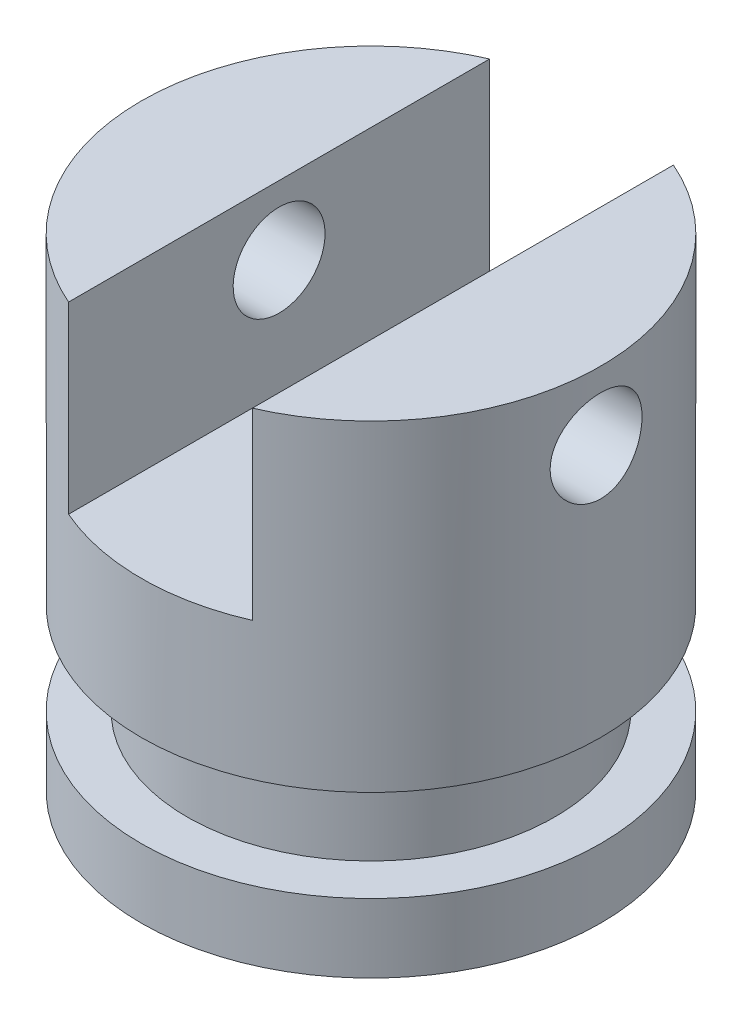
ISO-10303-21;
HEADER;
FILE_DESCRIPTION(('STEP AP214'),'2;1');
FILE_NAME('part.step','',(''),(''),'','','');
FILE_SCHEMA(('AUTOMOTIVE_DESIGN { 1 0 10303 214 1 1 1 1 }'));
ENDSEC;
DATA;
#1=APPLICATION_CONTEXT('core data for automotive mechanical design processes');
#2=APPLICATION_PROTOCOL_DEFINITION('international standard','automotive_design',2000,#1);
#3=PRODUCT_CONTEXT('',#1,'mechanical');
#4=PRODUCT('Part','Part','',(#3));
#5=PRODUCT_RELATED_PRODUCT_CATEGORY('part','',(#4));
#6=PRODUCT_DEFINITION_FORMATION('','',#4);
#7=PRODUCT_DEFINITION_CONTEXT('part definition',#1,'design');
#8=PRODUCT_DEFINITION('design','',#6,#7);
#9=PRODUCT_DEFINITION_SHAPE('','',#8);
#10=(LENGTH_UNIT() NAMED_UNIT(*) SI_UNIT(.MILLI.,.METRE.));
#11=(NAMED_UNIT(*) PLANE_ANGLE_UNIT() SI_UNIT($,.RADIAN.));
#12=(NAMED_UNIT(*) SI_UNIT($,.STERADIAN.) SOLID_ANGLE_UNIT());
#13=UNCERTAINTY_MEASURE_WITH_UNIT(LENGTH_MEASURE(1.E-05),#10,'distance_accuracy_value','');
#14=(GEOMETRIC_REPRESENTATION_CONTEXT(3) GLOBAL_UNCERTAINTY_ASSIGNED_CONTEXT((#13)) GLOBAL_UNIT_ASSIGNED_CONTEXT((#10,
#11,#12)) REPRESENTATION_CONTEXT('',''));
#15=CARTESIAN_POINT('',(0.,0.,0.));
#16=DIRECTION('',(0.,0.,1.));
#17=DIRECTION('',(1.,0.,0.));
#18=AXIS2_PLACEMENT_3D('',#15,#16,#17);
#19=CARTESIAN_POINT('',(5.,10.5,0.));
#20=DIRECTION('',(0.,-1.,0.));
#21=DIRECTION('',(1.,0.,0.));
#22=AXIS2_PLACEMENT_3D('',#19,#20,#21);
#23=PLANE('',#22);
#24=CARTESIAN_POINT('',(0.,10.5,0.));
#25=DIRECTION('',(0.,1.,0.));
#26=DIRECTION('',(-1.,0.,0.));
#27=AXIS2_PLACEMENT_3D('',#24,#25,#26);
#28=CIRCLE('',#27,5.);
#29=CARTESIAN_POINT('',(2.,10.5,4.58257569495584));
#30=VERTEX_POINT('',#29);
#31=CARTESIAN_POINT('',(2.,10.5,-4.58257569495584));
#32=VERTEX_POINT('',#31);
#33=EDGE_CURVE('E121',#30,#32,#28,.T.);
#34=ORIENTED_EDGE('',*,*,#33,.T.);
#35=DIRECTION('',(0.,0.,-1.));
#36=VECTOR('',#35,1.);
#37=CARTESIAN_POINT('',(2.,10.5,4.58257569495584));
#38=LINE('',#37,#36);
#39=EDGE_CURVE('E82',#30,#32,#38,.T.);
#40=ORIENTED_EDGE('',*,*,#39,.F.);
#41=EDGE_LOOP('',(#34,#40));
#42=FACE_BOUND('',#41,.T.);
#43=ADVANCED_FACE('F39',(#42),#23,.F.);
#44=CARTESIAN_POINT('',(0.,0.,0.));
#45=DIRECTION('',(0.,1.,0.));
#46=DIRECTION('',(-1.,0.,0.));
#47=AXIS2_PLACEMENT_3D('',#44,#45,#46);
#48=PLANE('',#47);
#49=CARTESIAN_POINT('',(0.,0.,0.));
#50=DIRECTION('',(0.,1.,0.));
#51=DIRECTION('',(-1.,0.,0.));
#52=AXIS2_PLACEMENT_3D('',#49,#50,#51);
#53=CIRCLE('',#52,5.);
#54=CARTESIAN_POINT('',(-5.,0.,0.));
#55=VERTEX_POINT('',#54);
#56=EDGE_CURVE('E134',#55,#55,#53,.T.);
#57=ORIENTED_EDGE('',*,*,#56,.F.);
#58=EDGE_LOOP('',(#57));
#59=FACE_BOUND('',#58,.T.);
#60=ADVANCED_FACE('F41',(#59),#48,.F.);
#61=CARTESIAN_POINT('',(0.,10.5,0.));
#62=DIRECTION('',(0.,1.,0.));
#63=DIRECTION('',(-1.,0.,0.));
#64=AXIS2_PLACEMENT_3D('',#61,#62,#63);
#65=CYLINDRICAL_SURFACE('',#64,5.);
#66=CARTESIAN_POINT('',(0.,1.5,0.));
#67=DIRECTION('',(0.,1.,0.));
#68=DIRECTION('',(-1.,0.,0.));
#69=AXIS2_PLACEMENT_3D('',#66,#67,#68);
#70=CIRCLE('',#69,5.);
#71=CARTESIAN_POINT('',(-5.,1.5,0.));
#72=VERTEX_POINT('',#71);
#73=EDGE_CURVE('E131',#72,#72,#70,.T.);
#74=ORIENTED_EDGE('',*,*,#73,.F.);
#75=EDGE_LOOP('',(#74));
#76=FACE_BOUND('',#75,.T.);
#77=ORIENTED_EDGE('',*,*,#56,.T.);
#78=EDGE_LOOP('',(#77));
#79=FACE_BOUND('',#78,.T.);
#80=ADVANCED_FACE('F172',(#76,#79),#65,.T.);
#81=CARTESIAN_POINT('',(5.,1.5,0.));
#82=DIRECTION('',(0.,-1.,0.));
#83=DIRECTION('',(1.,0.,0.));
#84=AXIS2_PLACEMENT_3D('',#81,#82,#83);
#85=PLANE('',#84);
#86=CARTESIAN_POINT('',(0.,1.5,0.));
#87=DIRECTION('',(0.,1.,0.));
#88=DIRECTION('',(-1.,0.,0.));
#89=AXIS2_PLACEMENT_3D('',#86,#87,#88);
#90=CIRCLE('',#89,4.);
#91=CARTESIAN_POINT('',(-4.,1.5,0.));
#92=VERTEX_POINT('',#91);
#93=EDGE_CURVE('E128',#92,#92,#90,.T.);
#94=ORIENTED_EDGE('',*,*,#93,.F.);
#95=EDGE_LOOP('',(#94));
#96=FACE_BOUND('',#95,.T.);
#97=ORIENTED_EDGE('',*,*,#73,.T.);
#98=EDGE_LOOP('',(#97));
#99=FACE_BOUND('',#98,.T.);
#100=ADVANCED_FACE('F239',(#96,#99),#85,.F.);
#101=CARTESIAN_POINT('',(0.,10.5,0.));
#102=DIRECTION('',(0.,1.,0.));
#103=DIRECTION('',(-1.,0.,0.));
#104=AXIS2_PLACEMENT_3D('',#101,#102,#103);
#105=CYLINDRICAL_SURFACE('',#104,4.);
#106=CARTESIAN_POINT('',(0.,3.5,0.));
#107=DIRECTION('',(0.,1.,0.));
#108=DIRECTION('',(-1.,0.,0.));
#109=AXIS2_PLACEMENT_3D('',#106,#107,#108);
#110=CIRCLE('',#109,4.);
#111=CARTESIAN_POINT('',(-4.,3.5,0.));
#112=VERTEX_POINT('',#111);
#113=EDGE_CURVE('E125',#112,#112,#110,.T.);
#114=ORIENTED_EDGE('',*,*,#113,.F.);
#115=EDGE_LOOP('',(#114));
#116=FACE_BOUND('',#115,.T.);
#117=ORIENTED_EDGE('',*,*,#93,.T.);
#118=EDGE_LOOP('',(#117));
#119=FACE_BOUND('',#118,.T.);
#120=ADVANCED_FACE('F231',(#116,#119),#105,.T.);
#121=CARTESIAN_POINT('',(4.,3.5,0.));
#122=DIRECTION('',(0.,1.,0.));
#123=DIRECTION('',(-1.,0.,0.));
#124=AXIS2_PLACEMENT_3D('',#121,#122,#123);
#125=PLANE('',#124);
#126=CARTESIAN_POINT('',(0.,3.5,0.));
#127=DIRECTION('',(0.,1.,0.));
#128=DIRECTION('',(-1.,0.,0.));
#129=AXIS2_PLACEMENT_3D('',#126,#127,#128);
#130=CIRCLE('',#129,5.);
#131=CARTESIAN_POINT('',(-5.,3.5,0.));
#132=VERTEX_POINT('',#131);
#133=EDGE_CURVE('E122',#132,#132,#130,.T.);
#134=ORIENTED_EDGE('',*,*,#133,.F.);
#135=EDGE_LOOP('',(#134));
#136=FACE_BOUND('',#135,.T.);
#137=ORIENTED_EDGE('',*,*,#113,.T.);
#138=EDGE_LOOP('',(#137));
#139=FACE_BOUND('',#138,.T.);
#140=ADVANCED_FACE('F165',(#136,#139),#125,.F.);
#141=CARTESIAN_POINT('',(0.,10.5,0.));
#142=DIRECTION('',(0.,1.,0.));
#143=DIRECTION('',(-1.,0.,0.));
#144=AXIS2_PLACEMENT_3D('',#141,#142,#143);
#145=CYLINDRICAL_SURFACE('',#144,5.);
#146=CARTESIAN_POINT('',(-5.,8.,0.));
#147=CARTESIAN_POINT('',(-4.99999897580871,8.00000204449835,-0.0555769067926332));
#148=CARTESIAN_POINT('',(-4.99906385178231,8.00464884296765,-0.111179660201522));
#149=CARTESIAN_POINT('',(-4.99542365623231,8.02309850011525,-0.220813507689019));
#150=CARTESIAN_POINT('',(-4.99271717860186,8.03690863280151,-0.274843317541355));
#151=CARTESIAN_POINT('',(-4.98583649278287,8.07324127362079,-0.379730305263312));
#152=CARTESIAN_POINT('',(-4.98166369076718,8.09575543684469,-0.430590467933133));
#153=CARTESIAN_POINT('',(-4.97230398035314,8.1488322475113,-0.527807988864225));
#154=CARTESIAN_POINT('',(-4.96711713235707,8.17939441560721,-0.574165615075811));
#155=CARTESIAN_POINT('',(-4.9562216532997,8.24813849429144,-0.661693477314864));
#156=CARTESIAN_POINT('',(-4.95050745504347,8.2864083553912,-0.702793951158523));
#157=CARTESIAN_POINT('',(-4.93924180452588,8.3692924163917,-0.778036756608027));
#158=CARTESIAN_POINT('',(-4.93369036500424,8.41390711133512,-0.812178544770424));
#159=CARTESIAN_POINT('',(-4.92332441812615,8.50871619301188,-0.872831753347619));
#160=CARTESIAN_POINT('',(-4.91851707364946,8.55895764379636,-0.899270938865865));
#161=CARTESIAN_POINT('',(-4.91026268058418,8.66328181900408,-0.943305666580307));
#162=CARTESIAN_POINT('',(-4.90681549761962,8.71736416334635,-0.960902082437236));
#163=CARTESIAN_POINT('',(-4.90172805252205,8.82708436390792,-0.986525299884825));
#164=CARTESIAN_POINT('',(-4.90006470107188,8.88269254414223,-0.994674497958775));
#165=CARTESIAN_POINT('',(-4.89866375060627,8.99450982136434,-1.00155212772612));
#166=CARTESIAN_POINT('',(-4.89892595467841,9.05071885632015,-1.0002815227135));
#167=CARTESIAN_POINT('',(-4.90132551148185,9.16124678802101,-0.988454573101817));
#168=CARTESIAN_POINT('',(-4.90343452858764,9.21558140562732,-0.978038540243904));
#169=CARTESIAN_POINT('',(-4.90924546160001,9.321716076663,-0.948437884623049));
#170=CARTESIAN_POINT('',(-4.91294745357779,9.37351600891901,-0.929252843100679));
#171=CARTESIAN_POINT('',(-4.92155618500408,9.4735152617036,-0.882524783674718));
#172=CARTESIAN_POINT('',(-4.92647089813704,9.52168787956917,-0.854926151232113));
#173=CARTESIAN_POINT('',(-4.93694618773062,9.61277084997281,-0.792193574572677));
#174=CARTESIAN_POINT('',(-4.94250683838366,9.65568059685116,-0.757058764356827));
#175=CARTESIAN_POINT('',(-4.95377021241462,9.73582940245694,-0.679499934560582));
#176=CARTESIAN_POINT('',(-4.95947369210905,9.77295256785913,-0.636956161212443));
#177=CARTESIAN_POINT('',(-4.97028848714408,9.83955384630123,-0.546185024062009));
#178=CARTESIAN_POINT('',(-4.97539979488974,9.86903186129358,-0.497957587379388));
#179=CARTESIAN_POINT('',(-4.98446690160887,9.91952750922597,-0.39705938687892));
#180=CARTESIAN_POINT('',(-4.98842088848272,9.94053189364454,-0.3443818195853));
#181=CARTESIAN_POINT('',(-4.99471408987858,9.97336047403857,-0.236148976448665));
#182=CARTESIAN_POINT('',(-4.99705350000531,9.98518578207363,-0.180594050072449));
#183=CARTESIAN_POINT('',(-4.99982671866868,9.99915645379427,-0.0691794056271504));
#184=CARTESIAN_POINT('',(-5.0002917465247,10.0014604195403,-0.0133403283255763));
#185=CARTESIAN_POINT('',(-4.99935051930103,9.99675014105782,0.0979249341927138));
#186=CARTESIAN_POINT('',(-4.99794436941446,9.9897364206474,0.153351142443793));
#187=CARTESIAN_POINT('',(-4.99343832008018,9.96672162645604,0.261705659946541));
#188=CARTESIAN_POINT('',(-4.99035376404206,9.9508019315021,0.314651948339903));
#189=CARTESIAN_POINT('',(-4.98283552061033,9.91051601734419,0.417123627499667));
#190=CARTESIAN_POINT('',(-4.97840173214227,9.88614916532317,0.466648761637539));
#191=CARTESIAN_POINT('',(-4.96859911533294,9.82931750934869,0.561541173686216));
#192=CARTESIAN_POINT('',(-4.96321950437052,9.79675721896105,0.606850126752187));
#193=CARTESIAN_POINT('',(-4.95214734829882,9.72459080879272,0.691418019119206));
#194=CARTESIAN_POINT('',(-4.94645476968388,9.68498393360013,0.730676308930761));
#195=CARTESIAN_POINT('',(-4.93529303556965,9.59912664810888,0.802640590774175));
#196=CARTESIAN_POINT('',(-4.92982860233304,9.55278425577866,0.835237702448654));
#197=CARTESIAN_POINT('',(-4.91984191796194,9.45518863864332,0.892185420051204));
#198=CARTESIAN_POINT('',(-4.91531962913343,9.40393561042645,0.916536355922901));
#199=CARTESIAN_POINT('',(-4.90776740584383,9.29823175385045,0.956151841581958));
#200=CARTESIAN_POINT('',(-4.90472974872187,9.24379915878968,0.971463499791049));
#201=CARTESIAN_POINT('',(-4.90047436792025,9.1330665465091,0.992708651627194));
#202=CARTESIAN_POINT('',(-4.89925640691111,9.07676677379066,0.998643368225111));
#203=CARTESIAN_POINT('',(-4.89879149631379,8.96499113545568,1.00092091086747));
#204=CARTESIAN_POINT('',(-4.89950919189301,8.90951885107299,0.997435788070894));
#205=CARTESIAN_POINT('',(-4.90275573484614,8.79996835009498,0.981352304100059));
#206=CARTESIAN_POINT('',(-4.90528456767169,8.7458901223052,0.968754016129297));
#207=CARTESIAN_POINT('',(-4.91185264219159,8.64077228875946,0.934878568498953));
#208=CARTESIAN_POINT('',(-4.91588821018831,8.58972563949759,0.913622506717343));
#209=CARTESIAN_POINT('',(-4.9250171497417,8.49189627926556,0.863054644601603));
#210=CARTESIAN_POINT('',(-4.93011060998894,8.44511392627486,0.833742168774881));
#211=CARTESIAN_POINT('',(-4.94088960523225,8.35628442784969,0.767305914786413));
#212=CARTESIAN_POINT('',(-4.94658372909699,8.31433123473241,0.730057887235179));
#213=CARTESIAN_POINT('',(-4.95786081871955,8.23721379447083,0.64906436901314));
#214=CARTESIAN_POINT('',(-4.96344375863184,8.20205110968273,0.605317387153334));
#215=CARTESIAN_POINT('',(-4.97393832387971,8.13916535605355,0.512017629088245));
#216=CARTESIAN_POINT('',(-4.97884231219246,8.11152399671998,0.462408884429834));
#217=CARTESIAN_POINT('',(-4.98735125085,8.06501387740341,0.359166360940732));
#218=CARTESIAN_POINT('',(-4.99095737138616,8.04613721046751,0.305536260863126));
#219=CARTESIAN_POINT('',(-4.99576372595371,8.02134805195529,0.209821488923779));
#220=CARTESIAN_POINT('',(-4.99734303158452,8.01335680629224,0.168281664013785));
#221=CARTESIAN_POINT('',(-4.99946154139893,8.00268208764164,0.0844995252100672));
#222=CARTESIAN_POINT('',(-5.00000077873155,7.99999844549024,0.0422572337486191));
#223=CARTESIAN_POINT('',(-5.,8.,0.));
#224=B_SPLINE_CURVE_WITH_KNOTS('',3,(#146,#147,#148,#149,#150,#151,#152,#153,#154,#155,#156,
#157,#158,#159,#160,#161,#162,#163,#164,#165,#166,#167,#168,#169,#170,#171,#172,#173,#174,#175,
#176,#177,#178,#179,#180,#181,#182,#183,#184,#185,#186,#187,#188,#189,#190,#191,#192,#193,#194,
#195,#196,#197,#198,#199,#200,#201,#202,#203,#204,#205,#206,#207,#208,#209,#210,#211,#212,#213,
#214,#215,#216,#217,#218,#219,#220,#221,#222,#223),.UNSPECIFIED.,.T.,.F.,(4,2,2,2,2,2,2,2,2,2,2,
2,2,2,2,2,2,2,2,2,2,2,2,2,2,2,2,2,2,2,2,2,2,2,2,2,2,2,4),(0.,0.166576130661258,
0.333284650691322,0.499833735250341,0.666372902230862,0.834932670112185,1.00350559674736,
1.17361195005923,1.34370149365197,1.51156185103587,1.67940504281225,1.84471727006278,
2.01003739253729,2.17647490203592,2.3429315474967,2.5123825249135,2.6818356753982,
2.85155274854023,3.02124925698035,3.18810735676265,3.35495607657867,3.52030453950723,
3.68566539216022,3.85305066033358,4.02045388345929,4.19040628579225,4.36035188723466,
4.52940381032722,4.69843368330414,4.864397225677,5.03035943492607,5.19591961253109,
5.36149367581865,5.52988076239142,5.69830654532929,5.86849496675636,6.03852955517517,
6.16518775289893,6.29184191370995),.UNSPECIFIED.);
#225=CARTESIAN_POINT('',(-5.,8.,0.));
#226=VERTEX_POINT('',#225);
#227=EDGE_CURVE('E11',#226,#226,#224,.T.);
#228=ORIENTED_EDGE('',*,*,#227,.T.);
#229=EDGE_LOOP('',(#228));
#230=FACE_BOUND('',#229,.T.);
#231=CARTESIAN_POINT('',(4.89897948556636,9.,-0.999999999999998));
#232=CARTESIAN_POINT('',(4.89898059043933,8.94443562451802,-0.999997945876044));
#233=CARTESIAN_POINT('',(4.89993508346913,8.88884537669351,-0.995353171723654));
#234=CARTESIAN_POINT('',(4.90364431385263,8.77923749488159,-0.976912283588333));
#235=CARTESIAN_POINT('',(4.90640049166333,8.72522115536893,-0.963108847071179));
#236=CARTESIAN_POINT('',(4.91338873700356,8.62036269663707,-0.926795782617736));
#237=CARTESIAN_POINT('',(4.91761933615313,8.56951747846507,-0.90429481415208));
#238=CARTESIAN_POINT('',(4.92707799486421,8.47232515530538,-0.85124910767104));
#239=CARTESIAN_POINT('',(4.93230599875014,8.42597779946273,-0.820704818601293));
#240=CARTESIAN_POINT('',(4.9432529969268,8.3384389961455,-0.751979075653287));
#241=CARTESIAN_POINT('',(4.94897737836825,8.29732041211586,-0.713705655913277));
#242=CARTESIAN_POINT('',(4.9602247230302,8.22204246642119,-0.630806789021348));
#243=CARTESIAN_POINT('',(4.96574767210945,8.18788359258286,-0.586180896977993));
#244=CARTESIAN_POINT('',(4.97602796417448,8.1272119823715,-0.491361355924243));
#245=CARTESIAN_POINT('',(4.9807782144152,8.10076848618335,-0.441122567672205));
#246=CARTESIAN_POINT('',(4.98891736883662,8.05672506295188,-0.336804150387272));
#247=CARTESIAN_POINT('',(4.99230640044127,8.03912430809902,-0.282724881420551));
#248=CARTESIAN_POINT('',(4.9973032068841,8.01349280638038,-0.173016773278491));
#249=CARTESIAN_POINT('',(4.99893386288125,8.00533902242899,-0.117417739214812));
#250=CARTESIAN_POINT('',(5.00030921183606,7.99844904816169,-0.00561856843753471));
#251=CARTESIAN_POINT('',(5.00005408652759,7.99971195035418,0.0505815098318446));
#252=CARTESIAN_POINT('',(4.99770434868515,8.01152618021556,0.16114200074359));
#253=CARTESIAN_POINT('',(4.99563598365838,8.02194497716785,0.215517214298471));
#254=CARTESIAN_POINT('',(4.98992177159409,8.0515650324589,0.321731626580302));
#255=CARTESIAN_POINT('',(4.98627586144039,8.07076664219188,0.37357072374713));
#256=CARTESIAN_POINT('',(4.97777296019958,8.11753004014727,0.473619463200888));
#257=CARTESIAN_POINT('',(4.97290848175223,8.14514375110489,0.521804174133901));
#258=CARTESIAN_POINT('',(4.96250469473785,8.2079090772366,0.612905045859756));
#259=CARTESIAN_POINT('',(4.95696530855222,8.24306155977052,0.655820599525001));
#260=CARTESIAN_POINT('',(4.9457096436446,8.32063362210848,0.735951431053457));
#261=CARTESIAN_POINT('',(4.93999196457516,8.36316918672959,0.773054316573631));
#262=CARTESIAN_POINT('',(4.92911571598761,8.45391644245075,0.839618493176806));
#263=CARTESIAN_POINT('',(4.92395715704548,8.5021282408832,0.86907963972775));
#264=CARTESIAN_POINT('',(4.91478047472924,8.60302083182181,0.919562814801881));
#265=CARTESIAN_POINT('',(4.91076481563549,8.65571096763967,0.940566647777708));
#266=CARTESIAN_POINT('',(4.90436476321273,8.76397132372399,0.973390341627581));
#267=CARTESIAN_POINT('',(4.90198015728428,8.81954116761909,0.985211399456641));
#268=CARTESIAN_POINT('',(4.89915479267828,8.93096485799905,0.999166006036049));
#269=CARTESIAN_POINT('',(4.89868147057154,8.98679757431034,1.00146185889791));
#270=CARTESIAN_POINT('',(4.89964485688854,9.09804822319968,0.996737628310736));
#271=CARTESIAN_POINT('',(4.90108145700388,9.15346617911887,0.98971807312244));
#272=CARTESIAN_POINT('',(4.90567232494915,9.26176864029224,0.966702208074155));
#273=CARTESIAN_POINT('',(4.90880999014497,9.31467234303577,0.950792620839296));
#274=CARTESIAN_POINT('',(4.91643489351665,9.41706327902874,0.910541035308515));
#275=CARTESIAN_POINT('',(4.9209222428627,9.46655023043572,0.886198342373175));
#276=CARTESIAN_POINT('',(4.93081405962039,9.56141310995016,0.829404142215596));
#277=CARTESIAN_POINT('',(4.93622971864903,9.60672704630083,0.796851077982752));
#278=CARTESIAN_POINT('',(4.94733723826636,9.69130831200092,0.72469557221271));
#279=CARTESIAN_POINT('',(4.95302912723818,9.73057501824926,0.685092405144535));
#280=CARTESIAN_POINT('',(4.96415345869216,9.80256255918558,0.599232273497888));
#281=CARTESIAN_POINT('',(4.96958057708684,9.83517365465,0.552882498929627));
#282=CARTESIAN_POINT('',(4.9794712762862,9.89214588149958,0.455267896634753));
#283=CARTESIAN_POINT('',(4.98393489755211,9.91650735934478,0.404003275433505));
#284=CARTESIAN_POINT('',(4.99137294061067,9.95612887174664,0.298302680824011));
#285=CARTESIAN_POINT('',(4.99435579142604,9.97144051822625,0.243886673478076));
#286=CARTESIAN_POINT('',(4.9985323593766,9.99269124766385,0.133189454679911));
#287=CARTESIAN_POINT('',(4.99972629199843,9.99863145947568,0.0769084687112125));
#288=CARTESIAN_POINT('',(5.00018540454121,10.0009269809629,-0.0348728939036247));
#289=CARTESIAN_POINT('',(4.99948378549351,9.99744728045621,-0.0903698121415035));
#290=CARTESIAN_POINT('',(4.99630043560318,9.98136604945219,-0.199971031315643));
#291=CARTESIAN_POINT('',(4.99381872714351,9.96876463365192,-0.254075349753692));
#292=CARTESIAN_POINT('',(4.98735498365001,9.93487100790835,-0.359252749745097));
#293=CARTESIAN_POINT('',(4.98337637247912,9.91359862186881,-0.410332443240281));
#294=CARTESIAN_POINT('',(4.97434722123382,9.8629877586691,-0.508221220185952));
#295=CARTESIAN_POINT('',(4.96929659645878,9.83364864409628,-0.555029965767411));
#296=CARTESIAN_POINT('',(4.95857599157868,9.76718061293792,-0.643863890106357));
#297=CARTESIAN_POINT('',(4.95289733422142,9.72993366361323,-0.685799716116503));
#298=CARTESIAN_POINT('',(4.94161222903622,9.64894975990422,-0.762882617756845));
#299=CARTESIAN_POINT('',(4.93600579862875,9.60521127053126,-0.798028083202711));
#300=CARTESIAN_POINT('',(4.92543342749964,9.51192068329982,-0.8608922194552));
#301=CARTESIAN_POINT('',(4.92047503631328,9.46231103883963,-0.888526814639766));
#302=CARTESIAN_POINT('',(4.91185237184445,9.3590672267003,-0.935024049287807));
#303=CARTESIAN_POINT('',(4.90818692536957,9.30543676130208,-0.953894645979289));
#304=CARTESIAN_POINT('',(4.90329681128922,9.20973754456343,-0.978669139854271));
#305=CARTESIAN_POINT('',(4.90168784915661,9.16821458048855,-0.986653898522984));
#306=CARTESIAN_POINT('',(4.8995287845803,9.08446604544636,-0.997320017960408));
#307=CARTESIAN_POINT('',(4.89897864563277,9.04224049875183,-1.00000156156205));
#308=CARTESIAN_POINT('',(4.89897948556636,9.,-0.999999999999998));
#309=B_SPLINE_CURVE_WITH_KNOTS('',3,(#231,#232,#233,#234,#235,#236,#237,#238,#239,#240,#241,
#242,#243,#244,#245,#246,#247,#248,#249,#250,#251,#252,#253,#254,#255,#256,#257,#258,#259,#260,
#261,#262,#263,#264,#265,#266,#267,#268,#269,#270,#271,#272,#273,#274,#275,#276,#277,#278,#279,
#280,#281,#282,#283,#284,#285,#286,#287,#288,#289,#290,#291,#292,#293,#294,#295,#296,#297,#298,
#299,#300,#301,#302,#303,#304,#305,#306,#307,#308),.UNSPECIFIED.,.T.,.F.,(4,2,2,2,2,2,2,2,2,2,2,
2,2,2,2,2,2,2,2,2,2,2,2,2,2,2,2,2,2,2,2,2,2,2,2,2,2,2,4),(0.,0.166538463856525,
0.333210239259265,0.499716497915554,0.666213464834831,0.834822525459335,1.00344340032919,
1.17353400434947,1.34360868244057,1.51144248880577,1.67926012113745,1.84468789631034,
2.01012229071247,2.176599242198,2.34309535767563,2.5124934675998,2.68189478120217,
2.85165863170273,3.02140035013521,3.1882375780209,3.35506534525918,3.52029341780815,
3.68553510351895,3.85293059772017,4.02034332867705,4.19032601730947,4.36030156627601,
4.52929813576146,4.69827434689124,4.86431017412182,5.03034391364253,5.19600017072948,
5.3616695213218,5.53001152023093,5.69839338887277,5.86858898576537,6.03862975086429,
6.16523803634392,6.29184195681711),.UNSPECIFIED.);
#310=CARTESIAN_POINT('',(4.89897948556636,9.,-0.999999999999998));
#311=VERTEX_POINT('',#310);
#312=EDGE_CURVE('E52',#311,#311,#309,.T.);
#313=ORIENTED_EDGE('',*,*,#312,.T.);
#314=EDGE_LOOP('',(#313));
#315=FACE_BOUND('',#314,.T.);
#316=ORIENTED_EDGE('',*,*,#33,.F.);
#317=DIRECTION('',(0.,1.,0.));
#318=VECTOR('',#317,1.);
#319=CARTESIAN_POINT('',(2.,6.5,4.58257569495584));
#320=LINE('',#319,#318);
#321=CARTESIAN_POINT('',(2.,6.5,4.58257569495584));
#322=VERTEX_POINT('',#321);
#323=EDGE_CURVE('E96',#322,#30,#320,.T.);
#324=ORIENTED_EDGE('',*,*,#323,.F.);
#325=CARTESIAN_POINT('',(0.,6.5,0.));
#326=DIRECTION('',(0.,1.,0.));
#327=DIRECTION('',(-1.,0.,0.));
#328=AXIS2_PLACEMENT_3D('',#325,#326,#327);
#329=CIRCLE('',#328,5.);
#330=CARTESIAN_POINT('',(-2.,6.5,4.58257569495584));
#331=VERTEX_POINT('',#330);
#332=EDGE_CURVE('E100',#331,#322,#329,.T.);
#333=ORIENTED_EDGE('',*,*,#332,.F.);
#334=DIRECTION('',(0.,1.,0.));
#335=VECTOR('',#334,1.);
#336=CARTESIAN_POINT('',(-2.,6.5,4.58257569495584));
#337=LINE('',#336,#335);
#338=CARTESIAN_POINT('',(-2.,10.5,4.58257569495584));
#339=VERTEX_POINT('',#338);
#340=EDGE_CURVE('E89',#331,#339,#337,.T.);
#341=ORIENTED_EDGE('',*,*,#340,.T.);
#342=CARTESIAN_POINT('',(-2.,10.5,-4.58257569495584));
#343=VERTEX_POINT('',#342);
#344=EDGE_CURVE('E117',#343,#339,#28,.T.);
#345=ORIENTED_EDGE('',*,*,#344,.F.);
#346=DIRECTION('',(0.,1.,0.));
#347=VECTOR('',#346,1.);
#348=CARTESIAN_POINT('',(-2.,6.5,-4.58257569495584));
#349=LINE('',#348,#347);
#350=CARTESIAN_POINT('',(-2.,6.5,-4.58257569495584));
#351=VERTEX_POINT('',#350);
#352=EDGE_CURVE('E59',#351,#343,#349,.T.);
#353=ORIENTED_EDGE('',*,*,#352,.F.);
#354=CARTESIAN_POINT('',(0.,6.5,0.));
#355=DIRECTION('',(0.,1.,0.));
#356=DIRECTION('',(1.,0.,0.));
#357=AXIS2_PLACEMENT_3D('',#354,#355,#356);
#358=CIRCLE('',#357,5.);
#359=CARTESIAN_POINT('',(2.,6.5,-4.58257569495584));
#360=VERTEX_POINT('',#359);
#361=EDGE_CURVE('E102',#360,#351,#358,.T.);
#362=ORIENTED_EDGE('',*,*,#361,.F.);
#363=DIRECTION('',(0.,1.,0.));
#364=VECTOR('',#363,1.);
#365=CARTESIAN_POINT('',(2.,6.5,-4.58257569495584));
#366=LINE('',#365,#364);
#367=EDGE_CURVE('E68',#360,#32,#366,.T.);
#368=ORIENTED_EDGE('',*,*,#367,.T.);
#369=EDGE_LOOP('',(#316,#324,#333,#341,#345,#353,#362,#368));
#370=FACE_BOUND('',#369,.T.);
#371=ORIENTED_EDGE('',*,*,#133,.T.);
#372=EDGE_LOOP('',(#371));
#373=FACE_BOUND('',#372,.T.);
#374=ADVANCED_FACE('F106',(#230,#315,#370,#373),#145,.T.);
#375=ORIENTED_EDGE('',*,*,#344,.T.);
#376=DIRECTION('',(0.,0.,1.));
#377=VECTOR('',#376,1.);
#378=CARTESIAN_POINT('',(-2.,10.5,-4.58257569495584));
#379=LINE('',#378,#377);
#380=EDGE_CURVE('E91',#343,#339,#379,.T.);
#381=ORIENTED_EDGE('',*,*,#380,.F.);
#382=EDGE_LOOP('',(#375,#381));
#383=FACE_BOUND('',#382,.T.);
#384=ADVANCED_FACE('F155',(#383),#23,.F.);
#385=CARTESIAN_POINT('',(2.,6.5,4.58257569495584));
#386=DIRECTION('',(1.,0.,0.));
#387=DIRECTION('',(0.,1.,0.));
#388=AXIS2_PLACEMENT_3D('',#385,#386,#387);
#389=PLANE('',#388);
#390=CARTESIAN_POINT('',(2.,9.,0.));
#391=DIRECTION('',(1.,0.,0.));
#392=DIRECTION('',(0.,1.,0.));
#393=AXIS2_PLACEMENT_3D('',#390,#391,#392);
#394=CIRCLE('',#393,0.999999999999998);
#395=CARTESIAN_POINT('',(2.,10.,0.));
#396=VERTEX_POINT('',#395);
#397=EDGE_CURVE('E178',#396,#396,#394,.T.);
#398=ORIENTED_EDGE('',*,*,#397,.T.);
#399=EDGE_LOOP('',(#398));
#400=FACE_BOUND('',#399,.T.);
#401=ORIENTED_EDGE('',*,*,#39,.T.);
#402=ORIENTED_EDGE('',*,*,#367,.F.);
#403=DIRECTION('',(0.,0.,-1.));
#404=VECTOR('',#403,1.);
#405=CARTESIAN_POINT('',(2.,6.5,4.58257569495584));
#406=LINE('',#405,#404);
#407=EDGE_CURVE('E108',#322,#360,#406,.T.);
#408=ORIENTED_EDGE('',*,*,#407,.F.);
#409=ORIENTED_EDGE('',*,*,#323,.T.);
#410=EDGE_LOOP('',(#401,#402,#408,#409));
#411=FACE_BOUND('',#410,.T.);
#412=ADVANCED_FACE('F152',(#400,#411),#389,.F.);
#413=CARTESIAN_POINT('',(-2.,6.5,-4.58257569495584));
#414=DIRECTION('',(-1.,0.,0.));
#415=DIRECTION('',(0.,-1.,0.));
#416=AXIS2_PLACEMENT_3D('',#413,#414,#415);
#417=PLANE('',#416);
#418=CARTESIAN_POINT('',(-2.,9.,0.));
#419=DIRECTION('',(-1.,0.,0.));
#420=DIRECTION('',(0.,-1.,0.));
#421=AXIS2_PLACEMENT_3D('',#418,#419,#420);
#422=CIRCLE('',#421,0.999999999999998);
#423=CARTESIAN_POINT('',(-2.,8.,0.));
#424=VERTEX_POINT('',#423);
#425=EDGE_CURVE('E114',#424,#424,#422,.T.);
#426=ORIENTED_EDGE('',*,*,#425,.T.);
#427=EDGE_LOOP('',(#426));
#428=FACE_BOUND('',#427,.T.);
#429=ORIENTED_EDGE('',*,*,#380,.T.);
#430=ORIENTED_EDGE('',*,*,#340,.F.);
#431=DIRECTION('',(0.,0.,1.));
#432=VECTOR('',#431,1.);
#433=CARTESIAN_POINT('',(-2.,6.5,-4.58257569495584));
#434=LINE('',#433,#432);
#435=EDGE_CURVE('E86',#351,#331,#434,.T.);
#436=ORIENTED_EDGE('',*,*,#435,.F.);
#437=ORIENTED_EDGE('',*,*,#352,.T.);
#438=EDGE_LOOP('',(#429,#430,#436,#437));
#439=FACE_BOUND('',#438,.T.);
#440=ADVANCED_FACE('F90',(#428,#439),#417,.F.);
#441=CARTESIAN_POINT('',(0.,6.5,0.));
#442=DIRECTION('',(0.,-1.,0.));
#443=DIRECTION('',(1.,0.,0.));
#444=AXIS2_PLACEMENT_3D('',#441,#442,#443);
#445=PLANE('',#444);
#446=ORIENTED_EDGE('',*,*,#361,.T.);
#447=ORIENTED_EDGE('',*,*,#435,.T.);
#448=ORIENTED_EDGE('',*,*,#332,.T.);
#449=ORIENTED_EDGE('',*,*,#407,.T.);
#450=EDGE_LOOP('',(#446,#447,#448,#449));
#451=FACE_BOUND('',#450,.T.);
#452=ADVANCED_FACE('F99',(#451),#445,.F.);
#453=CARTESIAN_POINT('',(5.,9.,0.));
#454=DIRECTION('',(1.,0.,0.));
#455=DIRECTION('',(0.,0.,-1.));
#456=AXIS2_PLACEMENT_3D('',#453,#454,#455);
#457=CYLINDRICAL_SURFACE('',#456,0.999999999999998);
#458=ORIENTED_EDGE('',*,*,#312,.F.);
#459=EDGE_LOOP('',(#458));
#460=FACE_BOUND('',#459,.T.);
#461=ORIENTED_EDGE('',*,*,#397,.F.);
#462=EDGE_LOOP('',(#461));
#463=FACE_BOUND('',#462,.T.);
#464=ADVANCED_FACE('F147',(#460,#463),#457,.F.);
#465=ORIENTED_EDGE('',*,*,#227,.F.);
#466=EDGE_LOOP('',(#465));
#467=FACE_BOUND('',#466,.T.);
#468=ORIENTED_EDGE('',*,*,#425,.F.);
#469=EDGE_LOOP('',(#468));
#470=FACE_BOUND('',#469,.T.);
#471=ADVANCED_FACE('F143',(#467,#470),#457,.F.);
#472=CLOSED_SHELL('',(#43,#60,#80,#100,#120,#140,#374,#384,#412,#440,#452,#464,#471));
#473=MANIFOLD_SOLID_BREP('B2',#472);
#474=ADVANCED_BREP_SHAPE_REPRESENTATION('',(#18,#473),#14);
#475=SHAPE_DEFINITION_REPRESENTATION(#9,#474);
ENDSEC;
END-ISO-10303-21;
